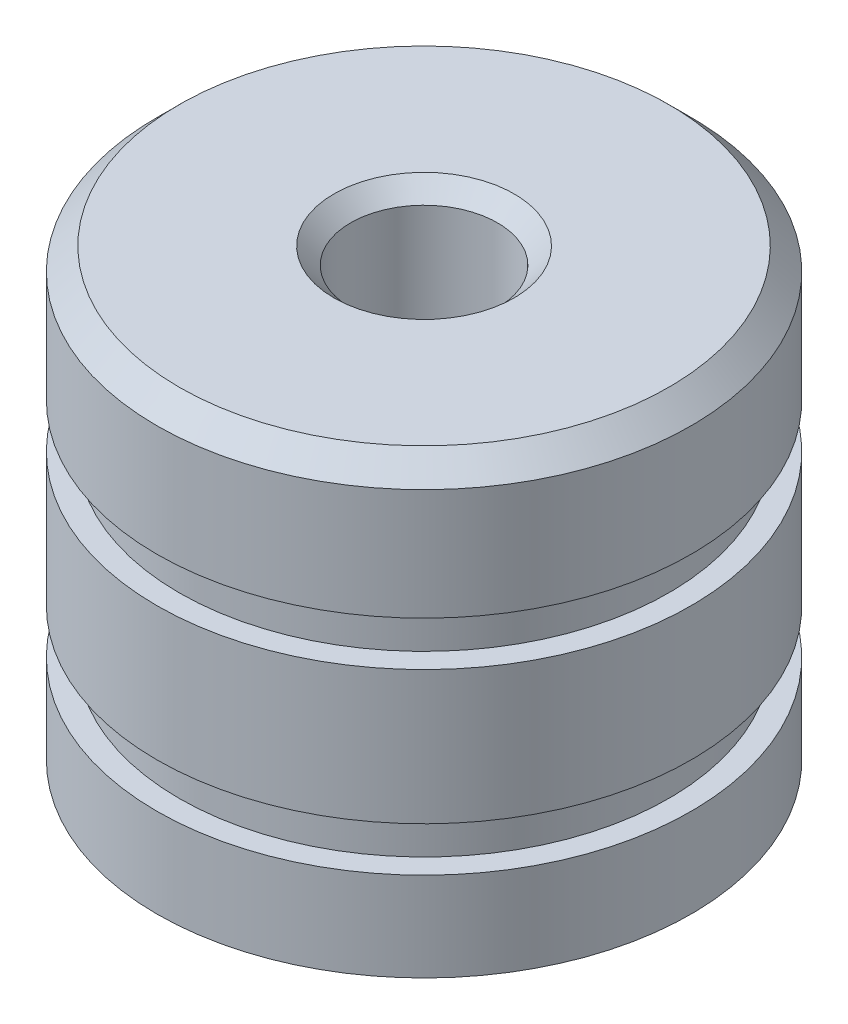
ISO-10303-21;
HEADER;
FILE_DESCRIPTION(('STEP AP214'),'2;1');
FILE_NAME('part.step','',(''),(''),'','','');
FILE_SCHEMA(('AUTOMOTIVE_DESIGN { 1 0 10303 214 1 1 1 1 }'));
ENDSEC;
DATA;
#1=APPLICATION_CONTEXT('core data for automotive mechanical design processes');
#2=APPLICATION_PROTOCOL_DEFINITION('international standard','automotive_design',2000,#1);
#3=PRODUCT_CONTEXT('',#1,'mechanical');
#4=PRODUCT('Part','Part','',(#3));
#5=PRODUCT_RELATED_PRODUCT_CATEGORY('part','',(#4));
#6=PRODUCT_DEFINITION_FORMATION('','',#4);
#7=PRODUCT_DEFINITION_CONTEXT('part definition',#1,'design');
#8=PRODUCT_DEFINITION('design','',#6,#7);
#9=PRODUCT_DEFINITION_SHAPE('','',#8);
#10=(LENGTH_UNIT() NAMED_UNIT(*) SI_UNIT(.MILLI.,.METRE.));
#11=(NAMED_UNIT(*) PLANE_ANGLE_UNIT() SI_UNIT($,.RADIAN.));
#12=(NAMED_UNIT(*) SI_UNIT($,.STERADIAN.) SOLID_ANGLE_UNIT());
#13=UNCERTAINTY_MEASURE_WITH_UNIT(LENGTH_MEASURE(1.E-05),#10,'distance_accuracy_value','');
#14=(GEOMETRIC_REPRESENTATION_CONTEXT(3) GLOBAL_UNCERTAINTY_ASSIGNED_CONTEXT((#13)) GLOBAL_UNIT_ASSIGNED_CONTEXT((#10,
#11,#12)) REPRESENTATION_CONTEXT('',''));
#15=CARTESIAN_POINT('',(0.,0.,0.));
#16=DIRECTION('',(0.,0.,1.));
#17=DIRECTION('',(1.,0.,0.));
#18=AXIS2_PLACEMENT_3D('',#15,#16,#17);
#19=CARTESIAN_POINT('',(0.,5.,0.));
#20=DIRECTION('',(0.,-1.,0.));
#21=DIRECTION('',(0.,0.,-1.));
#22=AXIS2_PLACEMENT_3D('',#19,#20,#21);
#23=CYLINDRICAL_SURFACE('',#22,6.);
#24=CARTESIAN_POINT('',(0.,4.5,0.));
#25=DIRECTION('',(0.,1.,0.));
#26=DIRECTION('',(0.,0.,1.));
#27=AXIS2_PLACEMENT_3D('',#24,#25,#26);
#28=CIRCLE('',#27,6.);
#29=CARTESIAN_POINT('',(0.,4.5,6.));
#30=VERTEX_POINT('',#29);
#31=EDGE_CURVE('E11',#30,#30,#28,.F.);
#32=ORIENTED_EDGE('',*,*,#31,.T.);
#33=EDGE_LOOP('',(#32));
#34=FACE_BOUND('',#33,.T.);
#35=CARTESIAN_POINT('',(0.,2.,0.));
#36=DIRECTION('',(0.,1.,0.));
#37=DIRECTION('',(0.,0.,1.));
#38=AXIS2_PLACEMENT_3D('',#35,#36,#37);
#39=CIRCLE('',#38,6.);
#40=CARTESIAN_POINT('',(0.,2.,6.));
#41=VERTEX_POINT('',#40);
#42=EDGE_CURVE('E88',#41,#41,#39,.T.);
#43=ORIENTED_EDGE('',*,*,#42,.T.);
#44=EDGE_LOOP('',(#43));
#45=FACE_BOUND('',#44,.T.);
#46=ADVANCED_FACE('F48',(#34,#45),#23,.T.);
#47=CARTESIAN_POINT('',(0.,5.,0.));
#48=DIRECTION('',(0.,1.,0.));
#49=DIRECTION('',(0.,0.,1.));
#50=AXIS2_PLACEMENT_3D('',#47,#48,#49);
#51=PLANE('',#50);
#52=CARTESIAN_POINT('',(0.,5.,0.));
#53=DIRECTION('',(0.,1.,0.));
#54=DIRECTION('',(0.,0.,1.));
#55=AXIS2_PLACEMENT_3D('',#52,#53,#54);
#56=CIRCLE('',#55,2.025);
#57=CARTESIAN_POINT('',(0.,5.,2.025));
#58=VERTEX_POINT('',#57);
#59=EDGE_CURVE('E80',#58,#58,#56,.T.);
#60=ORIENTED_EDGE('',*,*,#59,.F.);
#61=EDGE_LOOP('',(#60));
#62=FACE_BOUND('',#61,.T.);
#63=CARTESIAN_POINT('',(0.,5.,0.));
#64=DIRECTION('',(0.,1.,0.));
#65=DIRECTION('',(0.,0.,1.));
#66=AXIS2_PLACEMENT_3D('',#63,#64,#65);
#67=CIRCLE('',#66,5.50000000000001);
#68=CARTESIAN_POINT('',(0.,5.,5.50000000000001));
#69=VERTEX_POINT('',#68);
#70=EDGE_CURVE('E57',#69,#69,#67,.T.);
#71=ORIENTED_EDGE('',*,*,#70,.T.);
#72=EDGE_LOOP('',(#71));
#73=FACE_BOUND('',#72,.T.);
#74=ADVANCED_FACE('F118',(#62,#73),#51,.T.);
#75=CARTESIAN_POINT('',(0.,5.,0.));
#76=DIRECTION('',(0.,-1.,0.));
#77=DIRECTION('',(0.,0.,-1.));
#78=AXIS2_PLACEMENT_3D('',#75,#76,#77);
#79=CONICAL_SURFACE('',#78,5.50000000000001,0.785398163397444);
#80=ORIENTED_EDGE('',*,*,#31,.F.);
#81=EDGE_LOOP('',(#80));
#82=FACE_BOUND('',#81,.T.);
#83=ORIENTED_EDGE('',*,*,#70,.F.);
#84=EDGE_LOOP('',(#83));
#85=FACE_BOUND('',#84,.T.);
#86=ADVANCED_FACE('F51',(#82,#85),#79,.T.);
#87=CARTESIAN_POINT('',(0.,8.15052996977879,0.));
#88=DIRECTION('',(0.,1.,0.));
#89=DIRECTION('',(0.,0.,1.));
#90=AXIS2_PLACEMENT_3D('',#87,#88,#89);
#91=CYLINDRICAL_SURFACE('',#90,5.5);
#92=CARTESIAN_POINT('',(0.,1.,0.));
#93=DIRECTION('',(0.,1.,0.));
#94=DIRECTION('',(0.,0.,1.));
#95=AXIS2_PLACEMENT_3D('',#92,#93,#94);
#96=CIRCLE('',#95,5.5);
#97=CARTESIAN_POINT('',(0.,1.,5.5));
#98=VERTEX_POINT('',#97);
#99=EDGE_CURVE('E97',#98,#98,#96,.T.);
#100=ORIENTED_EDGE('',*,*,#99,.T.);
#101=EDGE_LOOP('',(#100));
#102=FACE_BOUND('',#101,.T.);
#103=CARTESIAN_POINT('',(0.,2.,0.));
#104=DIRECTION('',(0.,1.,0.));
#105=DIRECTION('',(0.,0.,1.));
#106=AXIS2_PLACEMENT_3D('',#103,#104,#105);
#107=CIRCLE('',#106,5.5);
#108=CARTESIAN_POINT('',(0.,2.,5.5));
#109=VERTEX_POINT('',#108);
#110=EDGE_CURVE('E84',#109,#109,#107,.T.);
#111=ORIENTED_EDGE('',*,*,#110,.F.);
#112=EDGE_LOOP('',(#111));
#113=FACE_BOUND('',#112,.T.);
#114=ADVANCED_FACE('F121',(#102,#113),#91,.T.);
#115=CARTESIAN_POINT('',(0.,1.,-5.5));
#116=DIRECTION('',(0.,1.,0.));
#117=DIRECTION('',(0.,0.,1.));
#118=AXIS2_PLACEMENT_3D('',#115,#116,#117);
#119=PLANE('',#118);
#120=CARTESIAN_POINT('',(0.,1.,0.));
#121=DIRECTION('',(0.,1.,0.));
#122=DIRECTION('',(0.,0.,1.));
#123=AXIS2_PLACEMENT_3D('',#120,#121,#122);
#124=CIRCLE('',#123,6.);
#125=CARTESIAN_POINT('',(0.,1.,6.));
#126=VERTEX_POINT('',#125);
#127=EDGE_CURVE('E93',#126,#126,#124,.T.);
#128=ORIENTED_EDGE('',*,*,#127,.T.);
#129=EDGE_LOOP('',(#128));
#130=FACE_BOUND('',#129,.T.);
#131=ORIENTED_EDGE('',*,*,#99,.F.);
#132=EDGE_LOOP('',(#131));
#133=FACE_BOUND('',#132,.T.);
#134=ADVANCED_FACE('F127',(#130,#133),#119,.T.);
#135=CARTESIAN_POINT('',(0.,2.,-5.5));
#136=DIRECTION('',(0.,-1.,0.));
#137=DIRECTION('',(0.,0.,-1.));
#138=AXIS2_PLACEMENT_3D('',#135,#136,#137);
#139=PLANE('',#138);
#140=ORIENTED_EDGE('',*,*,#110,.T.);
#141=EDGE_LOOP('',(#140));
#142=FACE_BOUND('',#141,.T.);
#143=ORIENTED_EDGE('',*,*,#42,.F.);
#144=EDGE_LOOP('',(#143));
#145=FACE_BOUND('',#144,.T.);
#146=ADVANCED_FACE('F145',(#142,#145),#139,.T.);
#147=CARTESIAN_POINT('',(0.,-2.,0.));
#148=DIRECTION('',(0.,1.,0.));
#149=DIRECTION('',(0.,0.,1.));
#150=AXIS2_PLACEMENT_3D('',#147,#148,#149);
#151=CIRCLE('',#150,6.);
#152=CARTESIAN_POINT('',(0.,-2.,6.));
#153=VERTEX_POINT('',#152);
#154=EDGE_CURVE('E89',#153,#153,#151,.T.);
#155=ORIENTED_EDGE('',*,*,#154,.T.);
#156=EDGE_LOOP('',(#155));
#157=FACE_BOUND('',#156,.T.);
#158=ORIENTED_EDGE('',*,*,#127,.F.);
#159=EDGE_LOOP('',(#158));
#160=FACE_BOUND('',#159,.T.);
#161=ADVANCED_FACE('F135',(#157,#160),#23,.T.);
#162=CARTESIAN_POINT('',(0.,-2.,-5.5));
#163=DIRECTION('',(0.,-1.,0.));
#164=DIRECTION('',(0.,0.,-1.));
#165=AXIS2_PLACEMENT_3D('',#162,#163,#164);
#166=PLANE('',#165);
#167=CARTESIAN_POINT('',(0.,-2.,0.));
#168=DIRECTION('',(0.,1.,0.));
#169=DIRECTION('',(0.,0.,1.));
#170=AXIS2_PLACEMENT_3D('',#167,#168,#169);
#171=CIRCLE('',#170,5.5);
#172=CARTESIAN_POINT('',(0.,-2.,5.5));
#173=VERTEX_POINT('',#172);
#174=EDGE_CURVE('E71',#173,#173,#171,.T.);
#175=ORIENTED_EDGE('',*,*,#174,.T.);
#176=EDGE_LOOP('',(#175));
#177=FACE_BOUND('',#176,.T.);
#178=ORIENTED_EDGE('',*,*,#154,.F.);
#179=EDGE_LOOP('',(#178));
#180=FACE_BOUND('',#179,.T.);
#181=ADVANCED_FACE('F144',(#177,#180),#166,.T.);
#182=CARTESIAN_POINT('',(0.,-3.,-5.5));
#183=DIRECTION('',(0.,1.,0.));
#184=DIRECTION('',(0.,0.,1.));
#185=AXIS2_PLACEMENT_3D('',#182,#183,#184);
#186=PLANE('',#185);
#187=CARTESIAN_POINT('',(0.,-3.,0.));
#188=DIRECTION('',(0.,1.,0.));
#189=DIRECTION('',(0.,0.,1.));
#190=AXIS2_PLACEMENT_3D('',#187,#188,#189);
#191=CIRCLE('',#190,6.);
#192=CARTESIAN_POINT('',(0.,-3.,6.));
#193=VERTEX_POINT('',#192);
#194=EDGE_CURVE('E105',#193,#193,#191,.T.);
#195=ORIENTED_EDGE('',*,*,#194,.T.);
#196=EDGE_LOOP('',(#195));
#197=FACE_BOUND('',#196,.T.);
#198=CARTESIAN_POINT('',(0.,-3.,0.));
#199=DIRECTION('',(0.,1.,0.));
#200=DIRECTION('',(0.,0.,1.));
#201=AXIS2_PLACEMENT_3D('',#198,#199,#200);
#202=CIRCLE('',#201,5.5);
#203=CARTESIAN_POINT('',(0.,-3.,5.5));
#204=VERTEX_POINT('',#203);
#205=EDGE_CURVE('E77',#204,#204,#202,.T.);
#206=ORIENTED_EDGE('',*,*,#205,.F.);
#207=EDGE_LOOP('',(#206));
#208=FACE_BOUND('',#207,.T.);
#209=ADVANCED_FACE('F151',(#197,#208),#186,.T.);
#210=CARTESIAN_POINT('',(0.,8.15052996977879,0.));
#211=DIRECTION('',(0.,1.,0.));
#212=DIRECTION('',(0.,0.,1.));
#213=AXIS2_PLACEMENT_3D('',#210,#211,#212);
#214=CYLINDRICAL_SURFACE('',#213,5.5);
#215=ORIENTED_EDGE('',*,*,#205,.T.);
#216=EDGE_LOOP('',(#215));
#217=FACE_BOUND('',#216,.T.);
#218=ORIENTED_EDGE('',*,*,#174,.F.);
#219=EDGE_LOOP('',(#218));
#220=FACE_BOUND('',#219,.T.);
#221=ADVANCED_FACE('F171',(#217,#220),#214,.T.);
#222=CARTESIAN_POINT('',(0.,-5.,0.));
#223=DIRECTION('',(0.,1.,0.));
#224=DIRECTION('',(0.,0.,1.));
#225=AXIS2_PLACEMENT_3D('',#222,#223,#224);
#226=PLANE('',#225);
#227=CARTESIAN_POINT('',(0.,-5.,0.));
#228=DIRECTION('',(0.,1.,0.));
#229=DIRECTION('',(0.,0.,1.));
#230=AXIS2_PLACEMENT_3D('',#227,#228,#229);
#231=CIRCLE('',#230,6.);
#232=CARTESIAN_POINT('',(0.,-5.,6.));
#233=VERTEX_POINT('',#232);
#234=EDGE_CURVE('E100',#233,#233,#231,.T.);
#235=ORIENTED_EDGE('',*,*,#234,.F.);
#236=EDGE_LOOP('',(#235));
#237=FACE_BOUND('',#236,.T.);
#238=ADVANCED_FACE('F141',(#237),#226,.F.);
#239=ORIENTED_EDGE('',*,*,#234,.T.);
#240=EDGE_LOOP('',(#239));
#241=FACE_BOUND('',#240,.T.);
#242=ORIENTED_EDGE('',*,*,#194,.F.);
#243=EDGE_LOOP('',(#242));
#244=FACE_BOUND('',#243,.T.);
#245=ADVANCED_FACE('F64',(#241,#244),#23,.T.);
#246=CARTESIAN_POINT('',(0.,-3.,0.));
#247=DIRECTION('',(0.,1.,0.));
#248=DIRECTION('',(0.,0.,1.));
#249=AXIS2_PLACEMENT_3D('',#246,#247,#248);
#250=CONICAL_SURFACE('',#249,1.65,1.02974425867665);
#251=CARTESIAN_POINT('',(0.,-3.99142002139548,0.));
#252=VERTEX_POINT('',#251);
#253=VERTEX_LOOP('',#252);
#254=FACE_BOUND('',#253,.T.);
#255=CARTESIAN_POINT('',(0.,-3.,0.));
#256=DIRECTION('',(0.,1.,0.));
#257=DIRECTION('',(0.,0.,1.));
#258=AXIS2_PLACEMENT_3D('',#255,#256,#257);
#259=CIRCLE('',#258,1.65);
#260=CARTESIAN_POINT('',(0.,-3.,1.65));
#261=VERTEX_POINT('',#260);
#262=EDGE_CURVE('E68',#261,#261,#259,.T.);
#263=ORIENTED_EDGE('',*,*,#262,.T.);
#264=EDGE_LOOP('',(#263));
#265=FACE_BOUND('',#264,.T.);
#266=ADVANCED_FACE('F60',(#254,#265),#250,.F.);
#267=CARTESIAN_POINT('',(0.,5.,0.));
#268=DIRECTION('',(0.,1.,0.));
#269=DIRECTION('',(0.,0.,1.));
#270=AXIS2_PLACEMENT_3D('',#267,#268,#269);
#271=CYLINDRICAL_SURFACE('',#270,1.64999999999999);
#272=ORIENTED_EDGE('',*,*,#262,.F.);
#273=EDGE_LOOP('',(#272));
#274=FACE_BOUND('',#273,.T.);
#275=CARTESIAN_POINT('',(0.,4.625,0.));
#276=DIRECTION('',(0.,1.,0.));
#277=DIRECTION('',(0.,0.,1.));
#278=AXIS2_PLACEMENT_3D('',#275,#276,#277);
#279=CIRCLE('',#278,1.64999999999999);
#280=CARTESIAN_POINT('',(0.,4.625,1.64999999999999));
#281=VERTEX_POINT('',#280);
#282=EDGE_CURVE('E72',#281,#281,#279,.T.);
#283=ORIENTED_EDGE('',*,*,#282,.T.);
#284=EDGE_LOOP('',(#283));
#285=FACE_BOUND('',#284,.T.);
#286=ADVANCED_FACE('F63',(#274,#285),#271,.F.);
#287=CARTESIAN_POINT('',(0.,5.,0.));
#288=DIRECTION('',(0.,1.,0.));
#289=DIRECTION('',(0.,0.,1.));
#290=AXIS2_PLACEMENT_3D('',#287,#288,#289);
#291=CONICAL_SURFACE('',#290,2.025,0.785398163397458);
#292=ORIENTED_EDGE('',*,*,#282,.F.);
#293=EDGE_LOOP('',(#292));
#294=FACE_BOUND('',#293,.T.);
#295=ORIENTED_EDGE('',*,*,#59,.T.);
#296=EDGE_LOOP('',(#295));
#297=FACE_BOUND('',#296,.T.);
#298=ADVANCED_FACE('F207',(#294,#297),#291,.F.);
#299=CLOSED_SHELL('',(#46,#74,#86,#114,#134,#146,#161,#181,#209,#221,#238,#245,#266,#286,#298));
#300=MANIFOLD_SOLID_BREP('B2',#299);
#301=ADVANCED_BREP_SHAPE_REPRESENTATION('',(#18,#300),#14);
#302=SHAPE_DEFINITION_REPRESENTATION(#9,#301);
ENDSEC;
END-ISO-10303-21;
